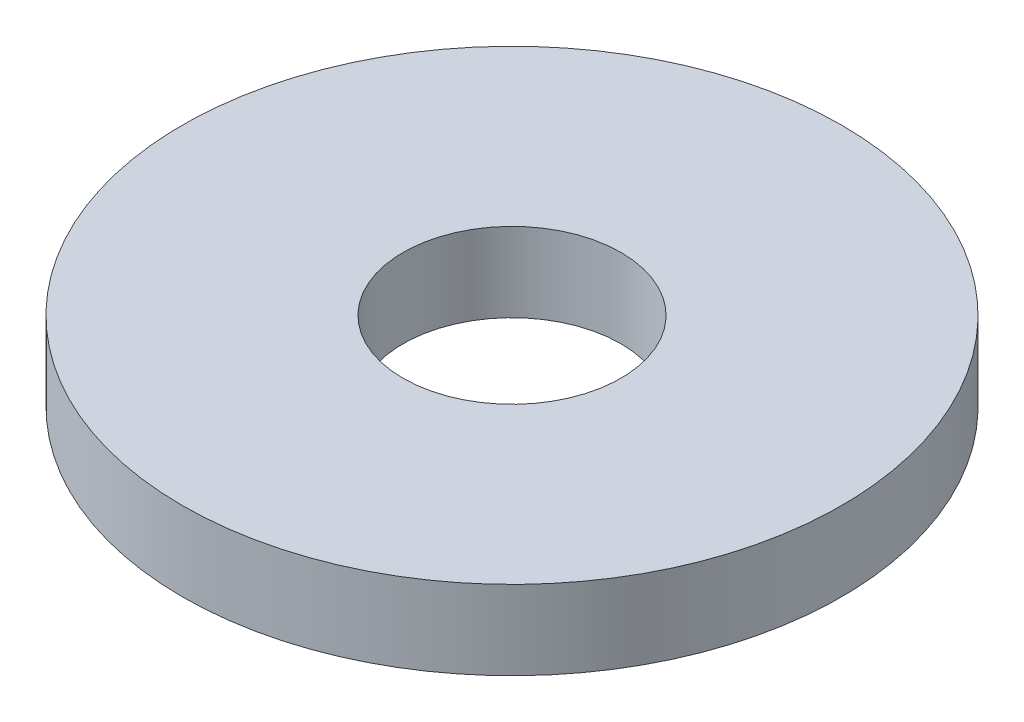
ISO-10303-21;
HEADER;
FILE_DESCRIPTION(('STEP AP214'),'2;1');
FILE_NAME('part.step','',(''),(''),'','','');
FILE_SCHEMA(('AUTOMOTIVE_DESIGN { 1 0 10303 214 1 1 1 1 }'));
ENDSEC;
DATA;
#1=APPLICATION_CONTEXT('core data for automotive mechanical design processes');
#2=APPLICATION_PROTOCOL_DEFINITION('international standard','automotive_design',2000,#1);
#3=PRODUCT_CONTEXT('',#1,'mechanical');
#4=PRODUCT('Part','Part','',(#3));
#5=PRODUCT_RELATED_PRODUCT_CATEGORY('part','',(#4));
#6=PRODUCT_DEFINITION_FORMATION('','',#4);
#7=PRODUCT_DEFINITION_CONTEXT('part definition',#1,'design');
#8=PRODUCT_DEFINITION('design','',#6,#7);
#9=PRODUCT_DEFINITION_SHAPE('','',#8);
#10=(LENGTH_UNIT() NAMED_UNIT(*) SI_UNIT(.MILLI.,.METRE.));
#11=(NAMED_UNIT(*) PLANE_ANGLE_UNIT() SI_UNIT($,.RADIAN.));
#12=(NAMED_UNIT(*) SI_UNIT($,.STERADIAN.) SOLID_ANGLE_UNIT());
#13=UNCERTAINTY_MEASURE_WITH_UNIT(LENGTH_MEASURE(1.E-05),#10,'distance_accuracy_value','');
#14=(GEOMETRIC_REPRESENTATION_CONTEXT(3) GLOBAL_UNCERTAINTY_ASSIGNED_CONTEXT((#13)) GLOBAL_UNIT_ASSIGNED_CONTEXT((#10,
#11,#12)) REPRESENTATION_CONTEXT('',''));
#15=CARTESIAN_POINT('',(0.,0.,0.));
#16=DIRECTION('',(0.,0.,1.));
#17=DIRECTION('',(1.,0.,0.));
#18=AXIS2_PLACEMENT_3D('',#15,#16,#17);
#19=CARTESIAN_POINT('',(0.,1.143,0.));
#20=DIRECTION('',(0.,-1.,0.));
#21=DIRECTION('',(0.,0.,-1.));
#22=AXIS2_PLACEMENT_3D('',#19,#20,#21);
#23=CYLINDRICAL_SURFACE('',#22,4.7625);
#24=CARTESIAN_POINT('',(0.,1.143,0.));
#25=DIRECTION('',(0.,1.,0.));
#26=DIRECTION('',(0.,0.,1.));
#27=AXIS2_PLACEMENT_3D('',#24,#25,#26);
#28=CIRCLE('',#27,4.7625);
#29=CARTESIAN_POINT('',(0.,1.143,4.7625));
#30=VERTEX_POINT('',#29);
#31=EDGE_CURVE('E10',#30,#30,#28,.T.);
#32=ORIENTED_EDGE('',*,*,#31,.F.);
#33=EDGE_LOOP('',(#32));
#34=FACE_BOUND('',#33,.T.);
#35=CARTESIAN_POINT('',(0.,0.,0.));
#36=DIRECTION('',(0.,1.,0.));
#37=DIRECTION('',(0.,0.,1.));
#38=AXIS2_PLACEMENT_3D('',#35,#36,#37);
#39=CIRCLE('',#38,4.7625);
#40=CARTESIAN_POINT('',(0.,0.,4.7625));
#41=VERTEX_POINT('',#40);
#42=EDGE_CURVE('E33',#41,#41,#39,.T.);
#43=ORIENTED_EDGE('',*,*,#42,.T.);
#44=EDGE_LOOP('',(#43));
#45=FACE_BOUND('',#44,.T.);
#46=ADVANCED_FACE('F30',(#34,#45),#23,.T.);
#47=CARTESIAN_POINT('',(0.,1.143,0.));
#48=DIRECTION('',(0.,1.,0.));
#49=DIRECTION('',(0.,0.,1.));
#50=AXIS2_PLACEMENT_3D('',#47,#48,#49);
#51=PLANE('',#50);
#52=CARTESIAN_POINT('',(0.,1.143,0.));
#53=DIRECTION('',(0.,1.,0.));
#54=DIRECTION('',(0.,0.,1.));
#55=AXIS2_PLACEMENT_3D('',#52,#53,#54);
#56=CIRCLE('',#55,1.5748);
#57=CARTESIAN_POINT('',(0.,1.143,1.5748));
#58=VERTEX_POINT('',#57);
#59=EDGE_CURVE('E42',#58,#58,#56,.T.);
#60=ORIENTED_EDGE('',*,*,#59,.F.);
#61=EDGE_LOOP('',(#60));
#62=FACE_BOUND('',#61,.T.);
#63=ORIENTED_EDGE('',*,*,#31,.T.);
#64=EDGE_LOOP('',(#63));
#65=FACE_BOUND('',#64,.T.);
#66=ADVANCED_FACE('F57',(#62,#65),#51,.T.);
#67=CARTESIAN_POINT('',(0.,0.,0.));
#68=DIRECTION('',(0.,1.,0.));
#69=DIRECTION('',(0.,0.,1.));
#70=AXIS2_PLACEMENT_3D('',#67,#68,#69);
#71=PLANE('',#70);
#72=CARTESIAN_POINT('',(0.,0.,0.));
#73=DIRECTION('',(0.,1.,0.));
#74=DIRECTION('',(0.,0.,1.));
#75=AXIS2_PLACEMENT_3D('',#72,#73,#74);
#76=CIRCLE('',#75,1.5748);
#77=CARTESIAN_POINT('',(0.,0.,1.5748));
#78=VERTEX_POINT('',#77);
#79=EDGE_CURVE('E40',#78,#78,#76,.T.);
#80=ORIENTED_EDGE('',*,*,#79,.T.);
#81=EDGE_LOOP('',(#80));
#82=FACE_BOUND('',#81,.T.);
#83=ORIENTED_EDGE('',*,*,#42,.F.);
#84=EDGE_LOOP('',(#83));
#85=FACE_BOUND('',#84,.T.);
#86=ADVANCED_FACE('F48',(#82,#85),#71,.F.);
#87=CARTESIAN_POINT('',(0.,0.,0.));
#88=DIRECTION('',(0.,1.,0.));
#89=DIRECTION('',(0.,0.,1.));
#90=AXIS2_PLACEMENT_3D('',#87,#88,#89);
#91=CYLINDRICAL_SURFACE('',#90,1.5748);
#92=ORIENTED_EDGE('',*,*,#79,.F.);
#93=EDGE_LOOP('',(#92));
#94=FACE_BOUND('',#93,.T.);
#95=ORIENTED_EDGE('',*,*,#59,.T.);
#96=EDGE_LOOP('',(#95));
#97=FACE_BOUND('',#96,.T.);
#98=ADVANCED_FACE('F51',(#94,#97),#91,.F.);
#99=CLOSED_SHELL('',(#46,#66,#86,#98));
#100=MANIFOLD_SOLID_BREP('B2',#99);
#101=ADVANCED_BREP_SHAPE_REPRESENTATION('',(#18,#100),#14);
#102=SHAPE_DEFINITION_REPRESENTATION(#9,#101);
ENDSEC;
END-ISO-10303-21;
